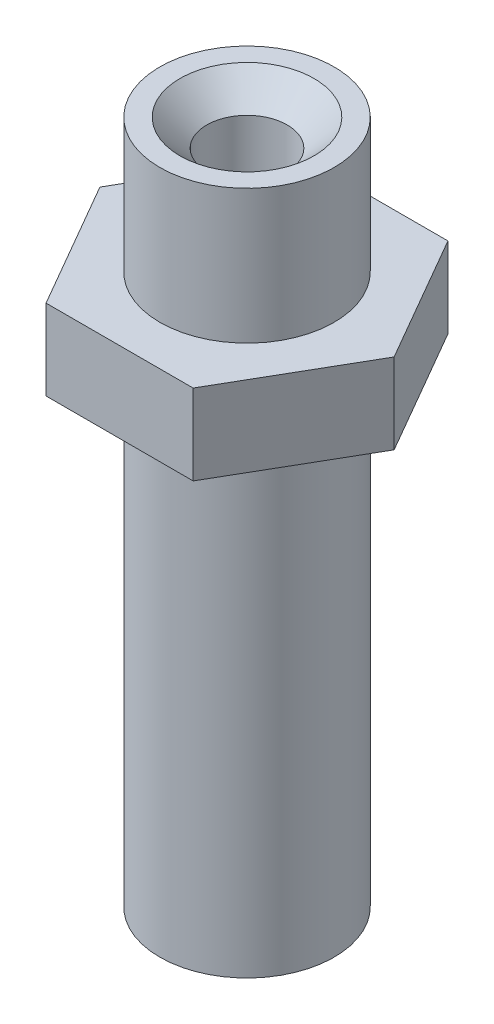
ISO-10303-21;
HEADER;
FILE_DESCRIPTION(('STEP AP214'),'2;1');
FILE_NAME('part.step','',(''),(''),'','','');
FILE_SCHEMA(('AUTOMOTIVE_DESIGN { 1 0 10303 214 1 1 1 1 }'));
ENDSEC;
DATA;
#1=APPLICATION_CONTEXT('core data for automotive mechanical design processes');
#2=APPLICATION_PROTOCOL_DEFINITION('international standard','automotive_design',2000,#1);
#3=PRODUCT_CONTEXT('',#1,'mechanical');
#4=PRODUCT('Part','Part','',(#3));
#5=PRODUCT_RELATED_PRODUCT_CATEGORY('part','',(#4));
#6=PRODUCT_DEFINITION_FORMATION('','',#4);
#7=PRODUCT_DEFINITION_CONTEXT('part definition',#1,'design');
#8=PRODUCT_DEFINITION('design','',#6,#7);
#9=PRODUCT_DEFINITION_SHAPE('','',#8);
#10=(LENGTH_UNIT() NAMED_UNIT(*) SI_UNIT(.MILLI.,.METRE.));
#11=(NAMED_UNIT(*) PLANE_ANGLE_UNIT() SI_UNIT($,.RADIAN.));
#12=(NAMED_UNIT(*) SI_UNIT($,.STERADIAN.) SOLID_ANGLE_UNIT());
#13=UNCERTAINTY_MEASURE_WITH_UNIT(LENGTH_MEASURE(1.E-05),#10,'distance_accuracy_value','');
#14=(GEOMETRIC_REPRESENTATION_CONTEXT(3) GLOBAL_UNCERTAINTY_ASSIGNED_CONTEXT((#13)) GLOBAL_UNIT_ASSIGNED_CONTEXT((#10,
#11,#12)) REPRESENTATION_CONTEXT('',''));
#15=CARTESIAN_POINT('',(0.,0.,0.));
#16=DIRECTION('',(0.,0.,1.));
#17=DIRECTION('',(1.,0.,0.));
#18=AXIS2_PLACEMENT_3D('',#15,#16,#17);
#19=CARTESIAN_POINT('',(0.,6.,-9.49999999999998));
#20=DIRECTION('',(0.,0.,1.));
#21=DIRECTION('',(1.,0.,0.));
#22=AXIS2_PLACEMENT_3D('',#19,#20,#21);
#23=PLANE('',#22);
#24=DIRECTION('',(-1.,0.,0.));
#25=VECTOR('',#24,1.);
#26=CARTESIAN_POINT('',(0.,0.,-9.49999999999998));
#27=LINE('',#26,#25);
#28=CARTESIAN_POINT('',(5.48482755730135,0.,-9.50000000000004));
#29=VERTEX_POINT('',#28);
#30=CARTESIAN_POINT('',(-5.48482755730155,0.,-9.49999999999992));
#31=VERTEX_POINT('',#30);
#32=EDGE_CURVE('E137',#29,#31,#27,.T.);
#33=ORIENTED_EDGE('',*,*,#32,.T.);
#34=DIRECTION('',(0.,-1.,0.));
#35=VECTOR('',#34,1.);
#36=CARTESIAN_POINT('',(-5.48482755730155,6.,-9.49999999999992));
#37=LINE('',#36,#35);
#38=CARTESIAN_POINT('',(-5.48482755730155,6.,-9.49999999999992));
#39=VERTEX_POINT('',#38);
#40=EDGE_CURVE('E165',#39,#31,#37,.T.);
#41=ORIENTED_EDGE('',*,*,#40,.F.);
#42=DIRECTION('',(-1.,0.,0.));
#43=VECTOR('',#42,1.);
#44=CARTESIAN_POINT('',(0.,6.,-9.49999999999998));
#45=LINE('',#44,#43);
#46=CARTESIAN_POINT('',(5.48482755730135,6.,-9.50000000000004));
#47=VERTEX_POINT('',#46);
#48=EDGE_CURVE('E379',#47,#39,#45,.T.);
#49=ORIENTED_EDGE('',*,*,#48,.F.);
#50=DIRECTION('',(0.,-1.,0.));
#51=VECTOR('',#50,1.);
#52=CARTESIAN_POINT('',(5.48482755730135,6.,-9.50000000000004));
#53=LINE('',#52,#51);
#54=EDGE_CURVE('E133',#47,#29,#53,.T.);
#55=ORIENTED_EDGE('',*,*,#54,.T.);
#56=EDGE_LOOP('',(#33,#41,#49,#55));
#57=FACE_BOUND('',#56,.T.);
#58=ADVANCED_FACE('F45',(#57),#23,.F.);
#59=CARTESIAN_POINT('',(-8.22724133595221,6.,-4.74999999999996));
#60=DIRECTION('',(0.866025403784441,0.,0.499999999999995));
#61=DIRECTION('',(0.499999999999995,0.,-0.866025403784441));
#62=AXIS2_PLACEMENT_3D('',#59,#60,#61);
#63=PLANE('',#62);
#64=DIRECTION('',(-0.499999999999995,0.,0.866025403784441));
#65=VECTOR('',#64,1.);
#66=CARTESIAN_POINT('',(-8.22724133595221,0.,-4.74999999999996));
#67=LINE('',#66,#65);
#68=CARTESIAN_POINT('',(-10.9696551146029,0.,0.));
#69=VERTEX_POINT('',#68);
#70=EDGE_CURVE('E141',#31,#69,#67,.T.);
#71=ORIENTED_EDGE('',*,*,#70,.T.);
#72=DIRECTION('',(0.,-1.,0.));
#73=VECTOR('',#72,1.);
#74=CARTESIAN_POINT('',(-10.9696551146029,6.,0.));
#75=LINE('',#74,#73);
#76=CARTESIAN_POINT('',(-10.9696551146029,6.,0.));
#77=VERTEX_POINT('',#76);
#78=EDGE_CURVE('E161',#77,#69,#75,.T.);
#79=ORIENTED_EDGE('',*,*,#78,.F.);
#80=DIRECTION('',(-0.499999999999995,0.,0.866025403784441));
#81=VECTOR('',#80,1.);
#82=CARTESIAN_POINT('',(-8.22724133595221,6.,-4.74999999999996));
#83=LINE('',#82,#81);
#84=EDGE_CURVE('E102',#39,#77,#83,.T.);
#85=ORIENTED_EDGE('',*,*,#84,.F.);
#86=ORIENTED_EDGE('',*,*,#40,.T.);
#87=EDGE_LOOP('',(#71,#79,#85,#86));
#88=FACE_BOUND('',#87,.T.);
#89=ADVANCED_FACE('F191',(#88),#63,.F.);
#90=CARTESIAN_POINT('',(-8.22724133595214,6.,4.75));
#91=DIRECTION('',(0.866025403784438,0.,-0.500000000000001));
#92=DIRECTION('',(-0.500000000000001,0.,-0.866025403784438));
#93=AXIS2_PLACEMENT_3D('',#90,#91,#92);
#94=PLANE('',#93);
#95=DIRECTION('',(0.500000000000001,0.,0.866025403784438));
#96=VECTOR('',#95,1.);
#97=CARTESIAN_POINT('',(-8.22724133595214,0.,4.75));
#98=LINE('',#97,#96);
#99=CARTESIAN_POINT('',(-5.48482755730141,0.,9.5));
#100=VERTEX_POINT('',#99);
#101=EDGE_CURVE('E145',#69,#100,#98,.T.);
#102=ORIENTED_EDGE('',*,*,#101,.T.);
#103=DIRECTION('',(0.,-1.,0.));
#104=VECTOR('',#103,1.);
#105=CARTESIAN_POINT('',(-5.48482755730141,6.,9.5));
#106=LINE('',#105,#104);
#107=CARTESIAN_POINT('',(-5.48482755730141,6.,9.5));
#108=VERTEX_POINT('',#107);
#109=EDGE_CURVE('E126',#108,#100,#106,.T.);
#110=ORIENTED_EDGE('',*,*,#109,.F.);
#111=DIRECTION('',(0.500000000000001,0.,0.866025403784438));
#112=VECTOR('',#111,1.);
#113=CARTESIAN_POINT('',(-8.22724133595214,6.,4.75));
#114=LINE('',#113,#112);
#115=EDGE_CURVE('E115',#77,#108,#114,.T.);
#116=ORIENTED_EDGE('',*,*,#115,.F.);
#117=ORIENTED_EDGE('',*,*,#78,.T.);
#118=EDGE_LOOP('',(#102,#110,#116,#117));
#119=FACE_BOUND('',#118,.T.);
#120=ADVANCED_FACE('F197',(#119),#94,.F.);
#121=CARTESIAN_POINT('',(0.,6.,9.49999999999998));
#122=DIRECTION('',(0.,0.,-1.));
#123=DIRECTION('',(-1.,0.,0.));
#124=AXIS2_PLACEMENT_3D('',#121,#122,#123);
#125=PLANE('',#124);
#126=DIRECTION('',(1.,0.,0.));
#127=VECTOR('',#126,1.);
#128=CARTESIAN_POINT('',(0.,0.,9.49999999999998));
#129=LINE('',#128,#127);
#130=CARTESIAN_POINT('',(5.48482755730148,0.,9.49999999999996));
#131=VERTEX_POINT('',#130);
#132=EDGE_CURVE('E124',#100,#131,#129,.T.);
#133=ORIENTED_EDGE('',*,*,#132,.T.);
#134=DIRECTION('',(0.,-1.,0.));
#135=VECTOR('',#134,1.);
#136=CARTESIAN_POINT('',(5.48482755730148,6.,9.49999999999996));
#137=LINE('',#136,#135);
#138=CARTESIAN_POINT('',(5.48482755730148,6.,9.49999999999996));
#139=VERTEX_POINT('',#138);
#140=EDGE_CURVE('E121',#139,#131,#137,.T.);
#141=ORIENTED_EDGE('',*,*,#140,.F.);
#142=DIRECTION('',(1.,0.,0.));
#143=VECTOR('',#142,1.);
#144=CARTESIAN_POINT('',(0.,6.,9.49999999999998));
#145=LINE('',#144,#143);
#146=EDGE_CURVE('E109',#108,#139,#145,.T.);
#147=ORIENTED_EDGE('',*,*,#146,.F.);
#148=ORIENTED_EDGE('',*,*,#109,.T.);
#149=EDGE_LOOP('',(#133,#141,#147,#148));
#150=FACE_BOUND('',#149,.T.);
#151=ADVANCED_FACE('F122',(#150),#125,.F.);
#152=CARTESIAN_POINT('',(8.22724133595218,6.,4.74999999999994));
#153=DIRECTION('',(-0.866025403784441,0.,-0.499999999999995));
#154=DIRECTION('',(-0.499999999999995,0.,0.866025403784442));
#155=AXIS2_PLACEMENT_3D('',#152,#153,#154);
#156=PLANE('',#155);
#157=DIRECTION('',(0.499999999999995,0.,-0.866025403784442));
#158=VECTOR('',#157,1.);
#159=CARTESIAN_POINT('',(8.22724133595218,0.,4.74999999999994));
#160=LINE('',#159,#158);
#161=CARTESIAN_POINT('',(10.9696551146029,0.,0.));
#162=VERTEX_POINT('',#161);
#163=EDGE_CURVE('E87',#131,#162,#160,.T.);
#164=ORIENTED_EDGE('',*,*,#163,.T.);
#165=DIRECTION('',(0.,-1.,0.));
#166=VECTOR('',#165,1.);
#167=CARTESIAN_POINT('',(10.9696551146029,6.,0.));
#168=LINE('',#167,#166);
#169=CARTESIAN_POINT('',(10.9696551146029,6.,0.));
#170=VERTEX_POINT('',#169);
#171=EDGE_CURVE('E127',#170,#162,#168,.T.);
#172=ORIENTED_EDGE('',*,*,#171,.F.);
#173=DIRECTION('',(0.499999999999995,0.,-0.866025403784442));
#174=VECTOR('',#173,1.);
#175=CARTESIAN_POINT('',(8.22724133595218,6.,4.74999999999994));
#176=LINE('',#175,#174);
#177=EDGE_CURVE('E113',#139,#170,#176,.T.);
#178=ORIENTED_EDGE('',*,*,#177,.F.);
#179=ORIENTED_EDGE('',*,*,#140,.T.);
#180=EDGE_LOOP('',(#164,#172,#178,#179));
#181=FACE_BOUND('',#180,.T.);
#182=ADVANCED_FACE('F129',(#181),#156,.F.);
#183=CARTESIAN_POINT('',(8.22724133595211,6.,-4.75000000000006));
#184=DIRECTION('',(-0.866025403784435,0.,0.500000000000007));
#185=DIRECTION('',(0.500000000000007,0.,0.866025403784434));
#186=AXIS2_PLACEMENT_3D('',#183,#184,#185);
#187=PLANE('',#186);
#188=DIRECTION('',(-0.500000000000007,0.,-0.866025403784435));
#189=VECTOR('',#188,1.);
#190=CARTESIAN_POINT('',(8.22724133595211,0.,-4.75000000000006));
#191=LINE('',#190,#189);
#192=EDGE_CURVE('E93',#162,#29,#191,.T.);
#193=ORIENTED_EDGE('',*,*,#192,.T.);
#194=ORIENTED_EDGE('',*,*,#54,.F.);
#195=DIRECTION('',(-0.500000000000007,0.,-0.866025403784435));
#196=VECTOR('',#195,1.);
#197=CARTESIAN_POINT('',(8.22724133595211,6.,-4.75000000000006));
#198=LINE('',#197,#196);
#199=EDGE_CURVE('E64',#170,#47,#198,.T.);
#200=ORIENTED_EDGE('',*,*,#199,.F.);
#201=ORIENTED_EDGE('',*,*,#171,.T.);
#202=EDGE_LOOP('',(#193,#194,#200,#201));
#203=FACE_BOUND('',#202,.T.);
#204=ADVANCED_FACE('F212',(#203),#187,.F.);
#205=CARTESIAN_POINT('',(0.,6.,0.));
#206=DIRECTION('',(0.,1.,0.));
#207=DIRECTION('',(0.,0.,1.));
#208=AXIS2_PLACEMENT_3D('',#205,#206,#207);
#209=PLANE('',#208);
#210=CARTESIAN_POINT('',(0.,6.,0.));
#211=DIRECTION('',(0.,1.,0.));
#212=DIRECTION('',(0.,0.,1.));
#213=AXIS2_PLACEMENT_3D('',#210,#211,#212);
#214=CIRCLE('',#213,6.5);
#215=CARTESIAN_POINT('',(0.,6.,6.5));
#216=VERTEX_POINT('',#215);
#217=EDGE_CURVE('E154',#216,#216,#214,.T.);
#218=ORIENTED_EDGE('',*,*,#217,.F.);
#219=EDGE_LOOP('',(#218));
#220=FACE_BOUND('',#219,.T.);
#221=ORIENTED_EDGE('',*,*,#48,.T.);
#222=ORIENTED_EDGE('',*,*,#84,.T.);
#223=ORIENTED_EDGE('',*,*,#115,.T.);
#224=ORIENTED_EDGE('',*,*,#146,.T.);
#225=ORIENTED_EDGE('',*,*,#177,.T.);
#226=ORIENTED_EDGE('',*,*,#199,.T.);
#227=EDGE_LOOP('',(#221,#222,#223,#224,#225,#226));
#228=FACE_BOUND('',#227,.T.);
#229=ADVANCED_FACE('F111',(#220,#228),#209,.T.);
#230=CARTESIAN_POINT('',(0.,0.,0.));
#231=DIRECTION('',(0.,1.,0.));
#232=DIRECTION('',(0.,0.,1.));
#233=AXIS2_PLACEMENT_3D('',#230,#231,#232);
#234=PLANE('',#233);
#235=CARTESIAN_POINT('',(0.,0.,0.));
#236=DIRECTION('',(0.,1.,0.));
#237=DIRECTION('',(0.,0.,1.));
#238=AXIS2_PLACEMENT_3D('',#235,#236,#237);
#239=CIRCLE('',#238,6.5);
#240=CARTESIAN_POINT('',(0.,0.,6.5));
#241=VERTEX_POINT('',#240);
#242=EDGE_CURVE('E367',#241,#241,#239,.T.);
#243=ORIENTED_EDGE('',*,*,#242,.T.);
#244=EDGE_LOOP('',(#243));
#245=FACE_BOUND('',#244,.T.);
#246=ORIENTED_EDGE('',*,*,#32,.F.);
#247=ORIENTED_EDGE('',*,*,#192,.F.);
#248=ORIENTED_EDGE('',*,*,#163,.F.);
#249=ORIENTED_EDGE('',*,*,#132,.F.);
#250=ORIENTED_EDGE('',*,*,#101,.F.);
#251=ORIENTED_EDGE('',*,*,#70,.F.);
#252=EDGE_LOOP('',(#246,#247,#248,#249,#250,#251));
#253=FACE_BOUND('',#252,.T.);
#254=ADVANCED_FACE('F215',(#245,#253),#234,.F.);
#255=CARTESIAN_POINT('',(0.,16.,0.));
#256=DIRECTION('',(0.,-1.,0.));
#257=DIRECTION('',(0.,0.,-1.));
#258=AXIS2_PLACEMENT_3D('',#255,#256,#257);
#259=CYLINDRICAL_SURFACE('',#258,3.);
#260=CARTESIAN_POINT('',(0.,-33.,0.));
#261=DIRECTION('',(0.,1.,0.));
#262=DIRECTION('',(0.,0.,1.));
#263=AXIS2_PLACEMENT_3D('',#260,#261,#262);
#264=CIRCLE('',#263,3.);
#265=CARTESIAN_POINT('',(0.,-33.,3.));
#266=VERTEX_POINT('',#265);
#267=EDGE_CURVE('E11',#266,#266,#264,.F.);
#268=ORIENTED_EDGE('',*,*,#267,.T.);
#269=EDGE_LOOP('',(#268));
#270=FACE_BOUND('',#269,.T.);
#271=CARTESIAN_POINT('',(0.,14.,0.));
#272=DIRECTION('',(0.,1.,0.));
#273=DIRECTION('',(0.,0.,1.));
#274=AXIS2_PLACEMENT_3D('',#271,#272,#273);
#275=CIRCLE('',#274,3.);
#276=CARTESIAN_POINT('',(0.,14.,3.));
#277=VERTEX_POINT('',#276);
#278=EDGE_CURVE('E168',#277,#277,#275,.T.);
#279=ORIENTED_EDGE('',*,*,#278,.T.);
#280=EDGE_LOOP('',(#279));
#281=FACE_BOUND('',#280,.T.);
#282=ADVANCED_FACE('F218',(#270,#281),#259,.F.);
#283=CARTESIAN_POINT('',(0.,16.,0.));
#284=DIRECTION('',(0.,-1.,0.));
#285=DIRECTION('',(0.,0.,-1.));
#286=AXIS2_PLACEMENT_3D('',#283,#284,#285);
#287=CYLINDRICAL_SURFACE('',#286,6.5);
#288=ORIENTED_EDGE('',*,*,#217,.T.);
#289=EDGE_LOOP('',(#288));
#290=FACE_BOUND('',#289,.T.);
#291=CARTESIAN_POINT('',(0.,16.,0.));
#292=DIRECTION('',(0.,1.,0.));
#293=DIRECTION('',(0.,0.,1.));
#294=AXIS2_PLACEMENT_3D('',#291,#292,#293);
#295=CIRCLE('',#294,6.5);
#296=CARTESIAN_POINT('',(0.,16.,6.5));
#297=VERTEX_POINT('',#296);
#298=EDGE_CURVE('E142',#297,#297,#295,.T.);
#299=ORIENTED_EDGE('',*,*,#298,.F.);
#300=EDGE_LOOP('',(#299));
#301=FACE_BOUND('',#300,.T.);
#302=ADVANCED_FACE('F225',(#290,#301),#287,.T.);
#303=CARTESIAN_POINT('',(0.,16.,0.));
#304=DIRECTION('',(0.,1.,0.));
#305=DIRECTION('',(0.,0.,1.));
#306=AXIS2_PLACEMENT_3D('',#303,#304,#305);
#307=PLANE('',#306);
#308=CARTESIAN_POINT('',(0.,16.,0.));
#309=DIRECTION('',(0.,1.,0.));
#310=DIRECTION('',(0.,0.,1.));
#311=AXIS2_PLACEMENT_3D('',#308,#309,#310);
#312=CIRCLE('',#311,5.);
#313=CARTESIAN_POINT('',(0.,16.,5.));
#314=VERTEX_POINT('',#313);
#315=EDGE_CURVE('E172',#314,#314,#312,.F.);
#316=ORIENTED_EDGE('',*,*,#315,.T.);
#317=EDGE_LOOP('',(#316));
#318=FACE_BOUND('',#317,.T.);
#319=ORIENTED_EDGE('',*,*,#298,.T.);
#320=EDGE_LOOP('',(#319));
#321=FACE_BOUND('',#320,.T.);
#322=ADVANCED_FACE('F229',(#318,#321),#307,.T.);
#323=CARTESIAN_POINT('',(0.,-35.,0.));
#324=DIRECTION('',(0.,1.,0.));
#325=DIRECTION('',(0.,0.,1.));
#326=AXIS2_PLACEMENT_3D('',#323,#324,#325);
#327=CYLINDRICAL_SURFACE('',#326,6.5);
#328=CARTESIAN_POINT('',(0.,-35.,0.));
#329=DIRECTION('',(0.,1.,0.));
#330=DIRECTION('',(0.,0.,1.));
#331=AXIS2_PLACEMENT_3D('',#328,#329,#330);
#332=CIRCLE('',#331,6.5);
#333=CARTESIAN_POINT('',(0.,-35.,6.5));
#334=VERTEX_POINT('',#333);
#335=EDGE_CURVE('E364',#334,#334,#332,.T.);
#336=ORIENTED_EDGE('',*,*,#335,.T.);
#337=EDGE_LOOP('',(#336));
#338=FACE_BOUND('',#337,.T.);
#339=ORIENTED_EDGE('',*,*,#242,.F.);
#340=EDGE_LOOP('',(#339));
#341=FACE_BOUND('',#340,.T.);
#342=ADVANCED_FACE('F233',(#338,#341),#327,.T.);
#343=CARTESIAN_POINT('',(0.,-35.,0.));
#344=DIRECTION('',(0.,1.,0.));
#345=DIRECTION('',(0.,0.,1.));
#346=AXIS2_PLACEMENT_3D('',#343,#344,#345);
#347=PLANE('',#346);
#348=CARTESIAN_POINT('',(0.,-35.,0.));
#349=DIRECTION('',(0.,1.,0.));
#350=DIRECTION('',(0.,0.,1.));
#351=AXIS2_PLACEMENT_3D('',#348,#349,#350);
#352=CIRCLE('',#351,5.00000000000001);
#353=CARTESIAN_POINT('',(0.,-35.,5.00000000000001));
#354=VERTEX_POINT('',#353);
#355=EDGE_CURVE('E56',#354,#354,#352,.T.);
#356=ORIENTED_EDGE('',*,*,#355,.T.);
#357=EDGE_LOOP('',(#356));
#358=FACE_BOUND('',#357,.T.);
#359=ORIENTED_EDGE('',*,*,#335,.F.);
#360=EDGE_LOOP('',(#359));
#361=FACE_BOUND('',#360,.T.);
#362=ADVANCED_FACE('F179',(#358,#361),#347,.F.);
#363=CARTESIAN_POINT('',(0.,14.,0.));
#364=DIRECTION('',(0.,1.,0.));
#365=DIRECTION('',(0.,0.,1.));
#366=AXIS2_PLACEMENT_3D('',#363,#364,#365);
#367=CONICAL_SURFACE('',#366,3.,0.785398163397449);
#368=ORIENTED_EDGE('',*,*,#315,.F.);
#369=EDGE_LOOP('',(#368));
#370=FACE_BOUND('',#369,.T.);
#371=ORIENTED_EDGE('',*,*,#278,.F.);
#372=EDGE_LOOP('',(#371));
#373=FACE_BOUND('',#372,.T.);
#374=ADVANCED_FACE('F183',(#370,#373),#367,.F.);
#375=CARTESIAN_POINT('',(0.,-35.,0.));
#376=DIRECTION('',(0.,-1.,0.));
#377=DIRECTION('',(0.,0.,-1.));
#378=AXIS2_PLACEMENT_3D('',#375,#376,#377);
#379=CONICAL_SURFACE('',#378,5.00000000000001,0.785398163397447);
#380=ORIENTED_EDGE('',*,*,#267,.F.);
#381=EDGE_LOOP('',(#380));
#382=FACE_BOUND('',#381,.T.);
#383=ORIENTED_EDGE('',*,*,#355,.F.);
#384=EDGE_LOOP('',(#383));
#385=FACE_BOUND('',#384,.T.);
#386=ADVANCED_FACE('F48',(#382,#385),#379,.F.);
#387=CLOSED_SHELL('',(#58,#89,#120,#151,#182,#204,#229,#254,#282,#302,#322,#342,#362,#374,#386));
#388=MANIFOLD_SOLID_BREP('B2',#387);
#389=ADVANCED_BREP_SHAPE_REPRESENTATION('',(#18,#388),#14);
#390=SHAPE_DEFINITION_REPRESENTATION(#9,#389);
ENDSEC;
END-ISO-10303-21;
